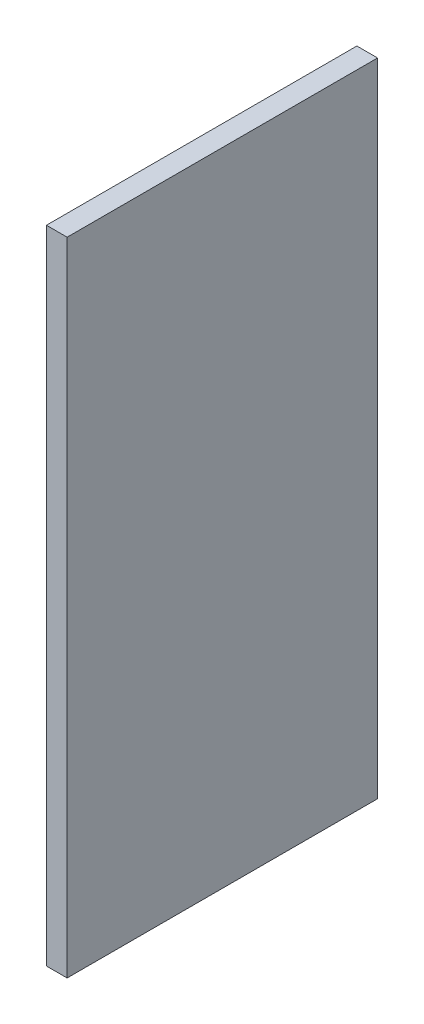
ISO-10303-21;
HEADER;
FILE_DESCRIPTION(('STEP AP214'),'2;1');
FILE_NAME('part.step','',(''),(''),'','','');
FILE_SCHEMA(('AUTOMOTIVE_DESIGN { 1 0 10303 214 1 1 1 1 }'));
ENDSEC;
DATA;
#1=APPLICATION_CONTEXT('core data for automotive mechanical design processes');
#2=APPLICATION_PROTOCOL_DEFINITION('international standard','automotive_design',2000,#1);
#3=PRODUCT_CONTEXT('',#1,'mechanical');
#4=PRODUCT('Part','Part','',(#3));
#5=PRODUCT_RELATED_PRODUCT_CATEGORY('part','',(#4));
#6=PRODUCT_DEFINITION_FORMATION('','',#4);
#7=PRODUCT_DEFINITION_CONTEXT('part definition',#1,'design');
#8=PRODUCT_DEFINITION('design','',#6,#7);
#9=PRODUCT_DEFINITION_SHAPE('','',#8);
#10=(LENGTH_UNIT() NAMED_UNIT(*) SI_UNIT(.MILLI.,.METRE.));
#11=(NAMED_UNIT(*) PLANE_ANGLE_UNIT() SI_UNIT($,.RADIAN.));
#12=(NAMED_UNIT(*) SI_UNIT($,.STERADIAN.) SOLID_ANGLE_UNIT());
#13=UNCERTAINTY_MEASURE_WITH_UNIT(LENGTH_MEASURE(1.E-05),#10,'distance_accuracy_value','');
#14=(GEOMETRIC_REPRESENTATION_CONTEXT(3) GLOBAL_UNCERTAINTY_ASSIGNED_CONTEXT((#13)) GLOBAL_UNIT_ASSIGNED_CONTEXT((#10,
#11,#12)) REPRESENTATION_CONTEXT('',''));
#15=CARTESIAN_POINT('',(0.,0.,0.));
#16=DIRECTION('',(0.,0.,1.));
#17=DIRECTION('',(1.,0.,0.));
#18=AXIS2_PLACEMENT_3D('',#15,#16,#17);
#19=CARTESIAN_POINT('',(0.,393.7,0.));
#20=DIRECTION('',(1.,0.,0.));
#21=DIRECTION('',(0.,0.,-1.));
#22=AXIS2_PLACEMENT_3D('',#19,#20,#21);
#23=PLANE('',#22);
#24=DIRECTION('',(0.,0.,1.));
#25=VECTOR('',#24,1.);
#26=CARTESIAN_POINT('',(0.,0.,0.));
#27=LINE('',#26,#25);
#28=CARTESIAN_POINT('',(0.,0.,-190.5));
#29=VERTEX_POINT('',#28);
#30=CARTESIAN_POINT('',(0.,0.,0.));
#31=VERTEX_POINT('',#30);
#32=EDGE_CURVE('E113',#29,#31,#27,.T.);
#33=ORIENTED_EDGE('',*,*,#32,.T.);
#34=DIRECTION('',(0.,-1.,0.));
#35=VECTOR('',#34,1.);
#36=CARTESIAN_POINT('',(0.,393.7,0.));
#37=LINE('',#36,#35);
#38=CARTESIAN_POINT('',(0.,393.7,0.));
#39=VERTEX_POINT('',#38);
#40=EDGE_CURVE('E11',#39,#31,#37,.T.);
#41=ORIENTED_EDGE('',*,*,#40,.F.);
#42=DIRECTION('',(0.,0.,1.));
#43=VECTOR('',#42,1.);
#44=CARTESIAN_POINT('',(0.,393.7,0.));
#45=LINE('',#44,#43);
#46=CARTESIAN_POINT('',(0.,393.7,-190.5));
#47=VERTEX_POINT('',#46);
#48=EDGE_CURVE('E97',#47,#39,#45,.T.);
#49=ORIENTED_EDGE('',*,*,#48,.F.);
#50=DIRECTION('',(0.,-1.,0.));
#51=VECTOR('',#50,1.);
#52=CARTESIAN_POINT('',(0.,393.7,-190.5));
#53=LINE('',#52,#51);
#54=EDGE_CURVE('E109',#47,#29,#53,.T.);
#55=ORIENTED_EDGE('',*,*,#54,.T.);
#56=EDGE_LOOP('',(#33,#41,#49,#55));
#57=FACE_BOUND('',#56,.T.);
#58=ADVANCED_FACE('F45',(#57),#23,.F.);
#59=CARTESIAN_POINT('',(0.,393.7,0.));
#60=DIRECTION('',(0.,0.,-1.));
#61=DIRECTION('',(-1.,0.,0.));
#62=AXIS2_PLACEMENT_3D('',#59,#60,#61);
#63=PLANE('',#62);
#64=DIRECTION('',(1.,0.,0.));
#65=VECTOR('',#64,1.);
#66=CARTESIAN_POINT('',(0.,0.,0.));
#67=LINE('',#66,#65);
#68=CARTESIAN_POINT('',(12.7,0.,0.));
#69=VERTEX_POINT('',#68);
#70=EDGE_CURVE('E102',#31,#69,#67,.T.);
#71=ORIENTED_EDGE('',*,*,#70,.T.);
#72=DIRECTION('',(0.,-1.,0.));
#73=VECTOR('',#72,1.);
#74=CARTESIAN_POINT('',(12.7,393.7,0.));
#75=LINE('',#74,#73);
#76=CARTESIAN_POINT('',(12.7,393.7,0.));
#77=VERTEX_POINT('',#76);
#78=EDGE_CURVE('E54',#77,#69,#75,.T.);
#79=ORIENTED_EDGE('',*,*,#78,.F.);
#80=DIRECTION('',(1.,0.,0.));
#81=VECTOR('',#80,1.);
#82=CARTESIAN_POINT('',(0.,393.7,0.));
#83=LINE('',#82,#81);
#84=EDGE_CURVE('E92',#39,#77,#83,.T.);
#85=ORIENTED_EDGE('',*,*,#84,.F.);
#86=ORIENTED_EDGE('',*,*,#40,.T.);
#87=EDGE_LOOP('',(#71,#79,#85,#86));
#88=FACE_BOUND('',#87,.T.);
#89=ADVANCED_FACE('F101',(#88),#63,.F.);
#90=CARTESIAN_POINT('',(12.7,393.7,0.));
#91=DIRECTION('',(-1.,0.,0.));
#92=DIRECTION('',(0.,0.,1.));
#93=AXIS2_PLACEMENT_3D('',#90,#91,#92);
#94=PLANE('',#93);
#95=DIRECTION('',(0.,0.,-1.));
#96=VECTOR('',#95,1.);
#97=CARTESIAN_POINT('',(12.7,0.,0.));
#98=LINE('',#97,#96);
#99=CARTESIAN_POINT('',(12.7,0.,-190.5));
#100=VERTEX_POINT('',#99);
#101=EDGE_CURVE('E79',#69,#100,#98,.T.);
#102=ORIENTED_EDGE('',*,*,#101,.T.);
#103=DIRECTION('',(0.,-1.,0.));
#104=VECTOR('',#103,1.);
#105=CARTESIAN_POINT('',(12.7,393.7,-190.5));
#106=LINE('',#105,#104);
#107=CARTESIAN_POINT('',(12.7,393.7,-190.5));
#108=VERTEX_POINT('',#107);
#109=EDGE_CURVE('E104',#108,#100,#106,.T.);
#110=ORIENTED_EDGE('',*,*,#109,.F.);
#111=DIRECTION('',(0.,0.,-1.));
#112=VECTOR('',#111,1.);
#113=CARTESIAN_POINT('',(12.7,393.7,0.));
#114=LINE('',#113,#112);
#115=EDGE_CURVE('E95',#77,#108,#114,.T.);
#116=ORIENTED_EDGE('',*,*,#115,.F.);
#117=ORIENTED_EDGE('',*,*,#78,.T.);
#118=EDGE_LOOP('',(#102,#110,#116,#117));
#119=FACE_BOUND('',#118,.T.);
#120=ADVANCED_FACE('F105',(#119),#94,.F.);
#121=CARTESIAN_POINT('',(0.,393.7,-190.5));
#122=DIRECTION('',(0.,0.,1.));
#123=DIRECTION('',(1.,0.,0.));
#124=AXIS2_PLACEMENT_3D('',#121,#122,#123);
#125=PLANE('',#124);
#126=DIRECTION('',(-1.,0.,0.));
#127=VECTOR('',#126,1.);
#128=CARTESIAN_POINT('',(0.,0.,-190.5));
#129=LINE('',#128,#127);
#130=EDGE_CURVE('E85',#100,#29,#129,.T.);
#131=ORIENTED_EDGE('',*,*,#130,.T.);
#132=ORIENTED_EDGE('',*,*,#54,.F.);
#133=DIRECTION('',(-1.,0.,0.));
#134=VECTOR('',#133,1.);
#135=CARTESIAN_POINT('',(0.,393.7,-190.5));
#136=LINE('',#135,#134);
#137=EDGE_CURVE('E62',#108,#47,#136,.T.);
#138=ORIENTED_EDGE('',*,*,#137,.F.);
#139=ORIENTED_EDGE('',*,*,#109,.T.);
#140=EDGE_LOOP('',(#131,#132,#138,#139));
#141=FACE_BOUND('',#140,.T.);
#142=ADVANCED_FACE('F126',(#141),#125,.F.);
#143=CARTESIAN_POINT('',(0.,393.7,0.));
#144=DIRECTION('',(0.,-1.,0.));
#145=DIRECTION('',(0.,0.,-1.));
#146=AXIS2_PLACEMENT_3D('',#143,#144,#145);
#147=PLANE('',#146);
#148=ORIENTED_EDGE('',*,*,#48,.T.);
#149=ORIENTED_EDGE('',*,*,#84,.T.);
#150=ORIENTED_EDGE('',*,*,#115,.T.);
#151=ORIENTED_EDGE('',*,*,#137,.T.);
#152=EDGE_LOOP('',(#148,#149,#150,#151));
#153=FACE_BOUND('',#152,.T.);
#154=ADVANCED_FACE('F93',(#153),#147,.F.);
#155=CARTESIAN_POINT('',(0.,0.,0.));
#156=DIRECTION('',(0.,-1.,0.));
#157=DIRECTION('',(0.,0.,-1.));
#158=AXIS2_PLACEMENT_3D('',#155,#156,#157);
#159=PLANE('',#158);
#160=ORIENTED_EDGE('',*,*,#32,.F.);
#161=ORIENTED_EDGE('',*,*,#130,.F.);
#162=ORIENTED_EDGE('',*,*,#101,.F.);
#163=ORIENTED_EDGE('',*,*,#70,.F.);
#164=EDGE_LOOP('',(#160,#161,#162,#163));
#165=FACE_BOUND('',#164,.T.);
#166=ADVANCED_FACE('F129',(#165),#159,.T.);
#167=CLOSED_SHELL('',(#58,#89,#120,#142,#154,#166));
#168=MANIFOLD_SOLID_BREP('B2',#167);
#169=ADVANCED_BREP_SHAPE_REPRESENTATION('',(#18,#168),#14);
#170=SHAPE_DEFINITION_REPRESENTATION(#9,#169);
ENDSEC;
END-ISO-10303-21;
